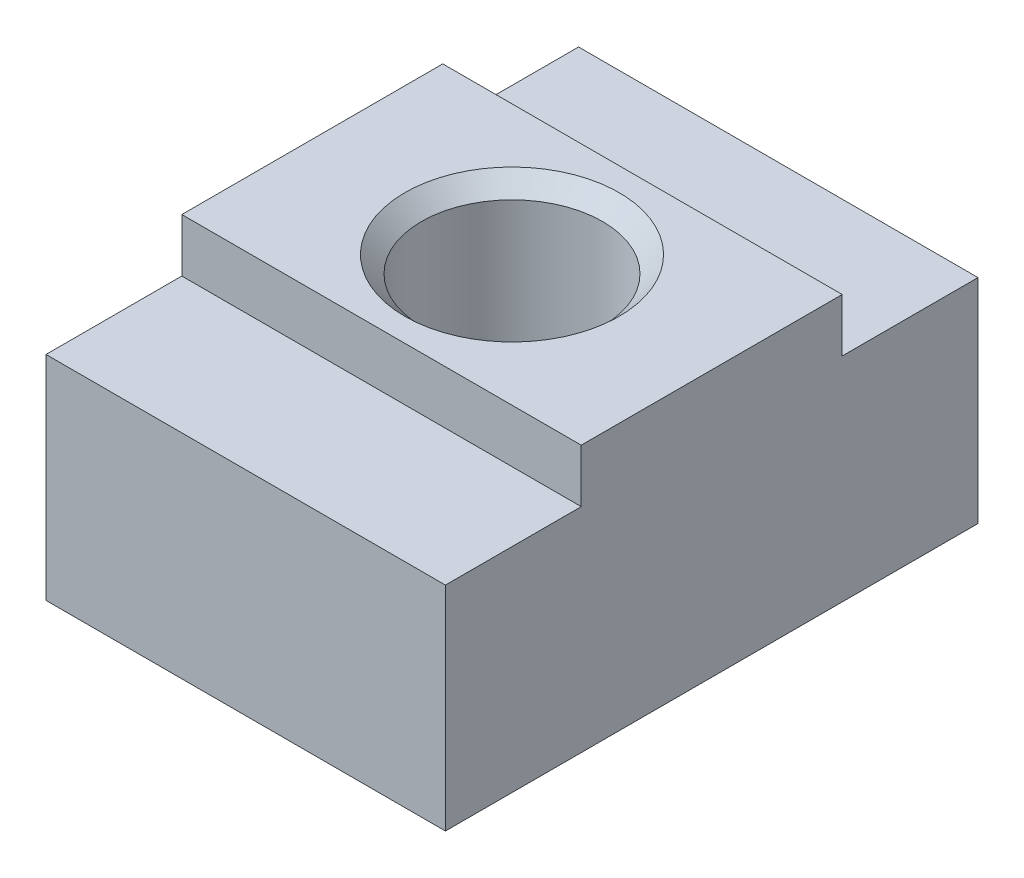
ISO-10303-21;
HEADER;
FILE_DESCRIPTION(('STEP AP214'),'2;1');
FILE_NAME('part.step','',(''),(''),'','','');
FILE_SCHEMA(('AUTOMOTIVE_DESIGN { 1 0 10303 214 1 1 1 1 }'));
ENDSEC;
DATA;
#1=APPLICATION_CONTEXT('core data for automotive mechanical design processes');
#2=APPLICATION_PROTOCOL_DEFINITION('international standard','automotive_design',2000,#1);
#3=PRODUCT_CONTEXT('',#1,'mechanical');
#4=PRODUCT('Part','Part','',(#3));
#5=PRODUCT_RELATED_PRODUCT_CATEGORY('part','',(#4));
#6=PRODUCT_DEFINITION_FORMATION('','',#4);
#7=PRODUCT_DEFINITION_CONTEXT('part definition',#1,'design');
#8=PRODUCT_DEFINITION('design','',#6,#7);
#9=PRODUCT_DEFINITION_SHAPE('','',#8);
#10=(LENGTH_UNIT() NAMED_UNIT(*) SI_UNIT(.MILLI.,.METRE.));
#11=(NAMED_UNIT(*) PLANE_ANGLE_UNIT() SI_UNIT($,.RADIAN.));
#12=(NAMED_UNIT(*) SI_UNIT($,.STERADIAN.) SOLID_ANGLE_UNIT());
#13=UNCERTAINTY_MEASURE_WITH_UNIT(LENGTH_MEASURE(1.E-05),#10,'distance_accuracy_value','');
#14=(GEOMETRIC_REPRESENTATION_CONTEXT(3) GLOBAL_UNCERTAINTY_ASSIGNED_CONTEXT((#13)) GLOBAL_UNIT_ASSIGNED_CONTEXT((#10,
#11,#12)) REPRESENTATION_CONTEXT('',''));
#15=CARTESIAN_POINT('',(0.,0.,0.));
#16=DIRECTION('',(0.,0.,1.));
#17=DIRECTION('',(1.,0.,0.));
#18=AXIS2_PLACEMENT_3D('',#15,#16,#17);
#19=CARTESIAN_POINT('',(7.5,10.,-10.));
#20=DIRECTION('',(0.,1.,0.));
#21=DIRECTION('',(0.,0.,1.));
#22=AXIS2_PLACEMENT_3D('',#19,#20,#21);
#23=CONICAL_SURFACE('',#22,4.025,0.785398163397447);
#24=CARTESIAN_POINT('',(7.5,9.375,-10.));
#25=DIRECTION('',(0.,1.,0.));
#26=DIRECTION('',(0.,0.,1.));
#27=AXIS2_PLACEMENT_3D('',#24,#25,#26);
#28=CIRCLE('',#27,3.4);
#29=CARTESIAN_POINT('',(7.5,9.375,-6.6));
#30=VERTEX_POINT('',#29);
#31=EDGE_CURVE('E11',#30,#30,#28,.T.);
#32=ORIENTED_EDGE('',*,*,#31,.F.);
#33=EDGE_LOOP('',(#32));
#34=FACE_BOUND('',#33,.T.);
#35=CARTESIAN_POINT('',(7.5,10.,-10.));
#36=DIRECTION('',(0.,1.,0.));
#37=DIRECTION('',(0.,0.,1.));
#38=AXIS2_PLACEMENT_3D('',#35,#36,#37);
#39=CIRCLE('',#38,4.025);
#40=CARTESIAN_POINT('',(7.5,10.,-5.975));
#41=VERTEX_POINT('',#40);
#42=EDGE_CURVE('E223',#41,#41,#39,.T.);
#43=ORIENTED_EDGE('',*,*,#42,.T.);
#44=EDGE_LOOP('',(#43));
#45=FACE_BOUND('',#44,.T.);
#46=ADVANCED_FACE('F17',(#34,#45),#23,.F.);
#47=CARTESIAN_POINT('',(7.5,10.,-10.));
#48=DIRECTION('',(0.,1.,0.));
#49=DIRECTION('',(0.,0.,1.));
#50=AXIS2_PLACEMENT_3D('',#47,#48,#49);
#51=CYLINDRICAL_SURFACE('',#50,3.4);
#52=CARTESIAN_POINT('',(7.5,0.625,-10.));
#53=DIRECTION('',(0.,1.,0.));
#54=DIRECTION('',(0.,0.,1.));
#55=AXIS2_PLACEMENT_3D('',#52,#53,#54);
#56=CIRCLE('',#55,3.4);
#57=CARTESIAN_POINT('',(7.5,0.625,-6.6));
#58=VERTEX_POINT('',#57);
#59=EDGE_CURVE('E26',#58,#58,#56,.T.);
#60=ORIENTED_EDGE('',*,*,#59,.F.);
#61=EDGE_LOOP('',(#60));
#62=FACE_BOUND('',#61,.T.);
#63=ORIENTED_EDGE('',*,*,#31,.T.);
#64=EDGE_LOOP('',(#63));
#65=FACE_BOUND('',#64,.T.);
#66=ADVANCED_FACE('F19',(#62,#65),#51,.F.);
#67=CARTESIAN_POINT('',(7.5,0.625,-10.));
#68=DIRECTION('',(0.,-1.,0.));
#69=DIRECTION('',(0.,0.,-1.));
#70=AXIS2_PLACEMENT_3D('',#67,#68,#69);
#71=CONICAL_SURFACE('',#70,3.4,0.785398163397446);
#72=ORIENTED_EDGE('',*,*,#59,.T.);
#73=EDGE_LOOP('',(#72));
#74=FACE_BOUND('',#73,.T.);
#75=CARTESIAN_POINT('',(7.5,0.,-10.));
#76=DIRECTION('',(0.,1.,0.));
#77=DIRECTION('',(0.,0.,1.));
#78=AXIS2_PLACEMENT_3D('',#75,#76,#77);
#79=CIRCLE('',#78,4.025);
#80=CARTESIAN_POINT('',(7.5,0.,-5.975));
#81=VERTEX_POINT('',#80);
#82=EDGE_CURVE('E178',#81,#81,#79,.T.);
#83=ORIENTED_EDGE('',*,*,#82,.F.);
#84=EDGE_LOOP('',(#83));
#85=FACE_BOUND('',#84,.T.);
#86=ADVANCED_FACE('F400',(#74,#85),#71,.F.);
#87=CARTESIAN_POINT('',(0.,10.,0.));
#88=DIRECTION('',(0.,1.,0.));
#89=DIRECTION('',(1.,0.,0.));
#90=AXIS2_PLACEMENT_3D('',#87,#88,#89);
#91=PLANE('',#90);
#92=ORIENTED_EDGE('',*,*,#42,.F.);
#93=EDGE_LOOP('',(#92));
#94=FACE_BOUND('',#93,.T.);
#95=DIRECTION('',(0.,0.,1.));
#96=VECTOR('',#95,1.);
#97=CARTESIAN_POINT('',(0.,10.,-5.1));
#98=LINE('',#97,#96);
#99=CARTESIAN_POINT('',(0.,10.,-14.9));
#100=VERTEX_POINT('',#99);
#101=CARTESIAN_POINT('',(0.,10.,-5.1));
#102=VERTEX_POINT('',#101);
#103=EDGE_CURVE('E156',#100,#102,#98,.T.);
#104=ORIENTED_EDGE('',*,*,#103,.T.);
#105=DIRECTION('',(1.,0.,0.));
#106=VECTOR('',#105,1.);
#107=CARTESIAN_POINT('',(15.,10.,-5.1));
#108=LINE('',#107,#106);
#109=CARTESIAN_POINT('',(15.,10.,-5.1));
#110=VERTEX_POINT('',#109);
#111=EDGE_CURVE('E202',#102,#110,#108,.T.);
#112=ORIENTED_EDGE('',*,*,#111,.T.);
#113=DIRECTION('',(0.,0.,-1.));
#114=VECTOR('',#113,1.);
#115=CARTESIAN_POINT('',(15.,10.,-5.1));
#116=LINE('',#115,#114);
#117=CARTESIAN_POINT('',(15.,10.,-14.9));
#118=VERTEX_POINT('',#117);
#119=EDGE_CURVE('E130',#110,#118,#116,.T.);
#120=ORIENTED_EDGE('',*,*,#119,.T.);
#121=DIRECTION('',(-1.,0.,0.));
#122=VECTOR('',#121,1.);
#123=CARTESIAN_POINT('',(15.,10.,-14.9));
#124=LINE('',#123,#122);
#125=EDGE_CURVE('E125',#118,#100,#124,.T.);
#126=ORIENTED_EDGE('',*,*,#125,.T.);
#127=EDGE_LOOP('',(#104,#112,#120,#126));
#128=FACE_BOUND('',#127,.T.);
#129=ADVANCED_FACE('F386',(#94,#128),#91,.T.);
#130=CARTESIAN_POINT('',(15.,10.,-14.9));
#131=DIRECTION('',(0.,0.,1.));
#132=DIRECTION('',(1.,0.,0.));
#133=AXIS2_PLACEMENT_3D('',#130,#131,#132);
#134=PLANE('',#133);
#135=DIRECTION('',(-1.,0.,0.));
#136=VECTOR('',#135,1.);
#137=CARTESIAN_POINT('',(15.,8.,-14.9));
#138=LINE('',#137,#136);
#139=CARTESIAN_POINT('',(15.,8.,-14.9));
#140=VERTEX_POINT('',#139);
#141=CARTESIAN_POINT('',(0.,8.,-14.9));
#142=VERTEX_POINT('',#141);
#143=EDGE_CURVE('E124',#140,#142,#138,.T.);
#144=ORIENTED_EDGE('',*,*,#143,.T.);
#145=DIRECTION('',(0.,-1.,0.));
#146=VECTOR('',#145,1.);
#147=CARTESIAN_POINT('',(0.,10.,-14.9));
#148=LINE('',#147,#146);
#149=EDGE_CURVE('E160',#100,#142,#148,.T.);
#150=ORIENTED_EDGE('',*,*,#149,.F.);
#151=ORIENTED_EDGE('',*,*,#125,.F.);
#152=DIRECTION('',(0.,-1.,0.));
#153=VECTOR('',#152,1.);
#154=CARTESIAN_POINT('',(15.,10.,-14.9));
#155=LINE('',#154,#153);
#156=EDGE_CURVE('E119',#118,#140,#155,.T.);
#157=ORIENTED_EDGE('',*,*,#156,.T.);
#158=EDGE_LOOP('',(#144,#150,#151,#157));
#159=FACE_BOUND('',#158,.T.);
#160=ADVANCED_FACE('F121',(#159),#134,.F.);
#161=CARTESIAN_POINT('',(15.,10.,-5.1));
#162=DIRECTION('',(0.,0.,-1.));
#163=DIRECTION('',(0.,-1.,0.));
#164=AXIS2_PLACEMENT_3D('',#161,#162,#163);
#165=PLANE('',#164);
#166=DIRECTION('',(1.,0.,0.));
#167=VECTOR('',#166,1.);
#168=CARTESIAN_POINT('',(15.,8.,-5.1));
#169=LINE('',#168,#167);
#170=CARTESIAN_POINT('',(0.,8.,-5.1));
#171=VERTEX_POINT('',#170);
#172=CARTESIAN_POINT('',(15.,8.,-5.1));
#173=VERTEX_POINT('',#172);
#174=EDGE_CURVE('E164',#171,#173,#169,.T.);
#175=ORIENTED_EDGE('',*,*,#174,.T.);
#176=DIRECTION('',(0.,-1.,0.));
#177=VECTOR('',#176,1.);
#178=CARTESIAN_POINT('',(15.,10.,-5.1));
#179=LINE('',#178,#177);
#180=EDGE_CURVE('E179',#110,#173,#179,.T.);
#181=ORIENTED_EDGE('',*,*,#180,.F.);
#182=ORIENTED_EDGE('',*,*,#111,.F.);
#183=DIRECTION('',(0.,-1.,0.));
#184=VECTOR('',#183,1.);
#185=CARTESIAN_POINT('',(0.,10.,-5.1));
#186=LINE('',#185,#184);
#187=EDGE_CURVE('E161',#102,#171,#186,.T.);
#188=ORIENTED_EDGE('',*,*,#187,.T.);
#189=EDGE_LOOP('',(#175,#181,#182,#188));
#190=FACE_BOUND('',#189,.T.);
#191=ADVANCED_FACE('F385',(#190),#165,.F.);
#192=CARTESIAN_POINT('',(0.,0.,0.));
#193=DIRECTION('',(0.,-1.,0.));
#194=DIRECTION('',(0.,0.,-1.));
#195=AXIS2_PLACEMENT_3D('',#192,#193,#194);
#196=PLANE('',#195);
#197=ORIENTED_EDGE('',*,*,#82,.T.);
#198=EDGE_LOOP('',(#197));
#199=FACE_BOUND('',#198,.T.);
#200=DIRECTION('',(0.,0.,1.));
#201=VECTOR('',#200,1.);
#202=CARTESIAN_POINT('',(0.,0.,0.));
#203=LINE('',#202,#201);
#204=CARTESIAN_POINT('',(0.,0.,-20.));
#205=VERTEX_POINT('',#204);
#206=CARTESIAN_POINT('',(0.,0.,0.));
#207=VERTEX_POINT('',#206);
#208=EDGE_CURVE('E196',#205,#207,#203,.T.);
#209=ORIENTED_EDGE('',*,*,#208,.F.);
#210=DIRECTION('',(-1.,0.,0.));
#211=VECTOR('',#210,1.);
#212=CARTESIAN_POINT('',(0.,0.,-20.));
#213=LINE('',#212,#211);
#214=CARTESIAN_POINT('',(15.,0.,-20.));
#215=VERTEX_POINT('',#214);
#216=EDGE_CURVE('E175',#215,#205,#213,.T.);
#217=ORIENTED_EDGE('',*,*,#216,.F.);
#218=DIRECTION('',(0.,0.,-1.));
#219=VECTOR('',#218,1.);
#220=CARTESIAN_POINT('',(15.,0.,0.));
#221=LINE('',#220,#219);
#222=CARTESIAN_POINT('',(15.,0.,0.));
#223=VERTEX_POINT('',#222);
#224=EDGE_CURVE('E210',#223,#215,#221,.T.);
#225=ORIENTED_EDGE('',*,*,#224,.F.);
#226=DIRECTION('',(1.,0.,0.));
#227=VECTOR('',#226,1.);
#228=CARTESIAN_POINT('',(0.,0.,0.));
#229=LINE('',#228,#227);
#230=EDGE_CURVE('E180',#207,#223,#229,.T.);
#231=ORIENTED_EDGE('',*,*,#230,.F.);
#232=EDGE_LOOP('',(#209,#217,#225,#231));
#233=FACE_BOUND('',#232,.T.);
#234=ADVANCED_FACE('F436',(#199,#233),#196,.T.);
#235=CARTESIAN_POINT('',(0.,8.,-20.));
#236=DIRECTION('',(0.,0.,1.));
#237=DIRECTION('',(1.,0.,0.));
#238=AXIS2_PLACEMENT_3D('',#235,#236,#237);
#239=PLANE('',#238);
#240=ORIENTED_EDGE('',*,*,#216,.T.);
#241=DIRECTION('',(0.,-1.,0.));
#242=VECTOR('',#241,1.);
#243=CARTESIAN_POINT('',(0.,8.,-20.));
#244=LINE('',#243,#242);
#245=CARTESIAN_POINT('',(0.,8.,-20.));
#246=VERTEX_POINT('',#245);
#247=EDGE_CURVE('E184',#246,#205,#244,.T.);
#248=ORIENTED_EDGE('',*,*,#247,.F.);
#249=DIRECTION('',(-1.,0.,0.));
#250=VECTOR('',#249,1.);
#251=CARTESIAN_POINT('',(0.,8.,-20.));
#252=LINE('',#251,#250);
#253=CARTESIAN_POINT('',(15.,8.,-20.));
#254=VERTEX_POINT('',#253);
#255=EDGE_CURVE('E142',#254,#246,#252,.T.);
#256=ORIENTED_EDGE('',*,*,#255,.F.);
#257=DIRECTION('',(0.,-1.,0.));
#258=VECTOR('',#257,1.);
#259=CARTESIAN_POINT('',(15.,8.,-20.));
#260=LINE('',#259,#258);
#261=EDGE_CURVE('E131',#254,#215,#260,.T.);
#262=ORIENTED_EDGE('',*,*,#261,.T.);
#263=EDGE_LOOP('',(#240,#248,#256,#262));
#264=FACE_BOUND('',#263,.T.);
#265=ADVANCED_FACE('F428',(#264),#239,.F.);
#266=CARTESIAN_POINT('',(15.,8.,0.));
#267=DIRECTION('',(-1.,0.,0.));
#268=DIRECTION('',(0.,0.,1.));
#269=AXIS2_PLACEMENT_3D('',#266,#267,#268);
#270=PLANE('',#269);
#271=ORIENTED_EDGE('',*,*,#224,.T.);
#272=ORIENTED_EDGE('',*,*,#261,.F.);
#273=DIRECTION('',(0.,0.,-1.));
#274=VECTOR('',#273,1.);
#275=CARTESIAN_POINT('',(15.,8.,0.));
#276=LINE('',#275,#274);
#277=EDGE_CURVE('E134',#140,#254,#276,.T.);
#278=ORIENTED_EDGE('',*,*,#277,.F.);
#279=ORIENTED_EDGE('',*,*,#156,.F.);
#280=ORIENTED_EDGE('',*,*,#119,.F.);
#281=ORIENTED_EDGE('',*,*,#180,.T.);
#282=DIRECTION('',(0.,0.,-1.));
#283=VECTOR('',#282,1.);
#284=CARTESIAN_POINT('',(15.,8.,0.));
#285=LINE('',#284,#283);
#286=CARTESIAN_POINT('',(15.,8.,0.));
#287=VERTEX_POINT('',#286);
#288=EDGE_CURVE('E188',#287,#173,#285,.T.);
#289=ORIENTED_EDGE('',*,*,#288,.F.);
#290=DIRECTION('',(0.,-1.,0.));
#291=VECTOR('',#290,1.);
#292=CARTESIAN_POINT('',(15.,8.,0.));
#293=LINE('',#292,#291);
#294=EDGE_CURVE('E154',#287,#223,#293,.T.);
#295=ORIENTED_EDGE('',*,*,#294,.T.);
#296=EDGE_LOOP('',(#271,#272,#278,#279,#280,#281,#289,#295));
#297=FACE_BOUND('',#296,.T.);
#298=ADVANCED_FACE('F136',(#297),#270,.F.);
#299=CARTESIAN_POINT('',(0.,8.,0.));
#300=DIRECTION('',(0.,0.,-1.));
#301=DIRECTION('',(0.,-1.,0.));
#302=AXIS2_PLACEMENT_3D('',#299,#300,#301);
#303=PLANE('',#302);
#304=ORIENTED_EDGE('',*,*,#230,.T.);
#305=ORIENTED_EDGE('',*,*,#294,.F.);
#306=DIRECTION('',(1.,0.,0.));
#307=VECTOR('',#306,1.);
#308=CARTESIAN_POINT('',(0.,8.,0.));
#309=LINE('',#308,#307);
#310=CARTESIAN_POINT('',(0.,8.,0.));
#311=VERTEX_POINT('',#310);
#312=EDGE_CURVE('E171',#311,#287,#309,.T.);
#313=ORIENTED_EDGE('',*,*,#312,.F.);
#314=DIRECTION('',(0.,-1.,0.));
#315=VECTOR('',#314,1.);
#316=CARTESIAN_POINT('',(0.,8.,0.));
#317=LINE('',#316,#315);
#318=EDGE_CURVE('E192',#311,#207,#317,.T.);
#319=ORIENTED_EDGE('',*,*,#318,.T.);
#320=EDGE_LOOP('',(#304,#305,#313,#319));
#321=FACE_BOUND('',#320,.T.);
#322=ADVANCED_FACE('F411',(#321),#303,.F.);
#323=CARTESIAN_POINT('',(0.,8.,0.));
#324=DIRECTION('',(1.,0.,0.));
#325=DIRECTION('',(0.,1.,0.));
#326=AXIS2_PLACEMENT_3D('',#323,#324,#325);
#327=PLANE('',#326);
#328=ORIENTED_EDGE('',*,*,#208,.T.);
#329=ORIENTED_EDGE('',*,*,#318,.F.);
#330=DIRECTION('',(0.,0.,1.));
#331=VECTOR('',#330,1.);
#332=CARTESIAN_POINT('',(0.,8.,0.));
#333=LINE('',#332,#331);
#334=EDGE_CURVE('E167',#171,#311,#333,.T.);
#335=ORIENTED_EDGE('',*,*,#334,.F.);
#336=ORIENTED_EDGE('',*,*,#187,.F.);
#337=ORIENTED_EDGE('',*,*,#103,.F.);
#338=ORIENTED_EDGE('',*,*,#149,.T.);
#339=DIRECTION('',(0.,0.,1.));
#340=VECTOR('',#339,1.);
#341=CARTESIAN_POINT('',(0.,8.,0.));
#342=LINE('',#341,#340);
#343=EDGE_CURVE('E147',#246,#142,#342,.T.);
#344=ORIENTED_EDGE('',*,*,#343,.F.);
#345=ORIENTED_EDGE('',*,*,#247,.T.);
#346=EDGE_LOOP('',(#328,#329,#335,#336,#337,#338,#344,#345));
#347=FACE_BOUND('',#346,.T.);
#348=ADVANCED_FACE('F394',(#347),#327,.F.);
#349=CARTESIAN_POINT('',(0.,8.,0.));
#350=DIRECTION('',(0.,-1.,0.));
#351=DIRECTION('',(0.,0.,-1.));
#352=AXIS2_PLACEMENT_3D('',#349,#350,#351);
#353=PLANE('',#352);
#354=ORIENTED_EDGE('',*,*,#174,.F.);
#355=ORIENTED_EDGE('',*,*,#334,.T.);
#356=ORIENTED_EDGE('',*,*,#312,.T.);
#357=ORIENTED_EDGE('',*,*,#288,.T.);
#358=EDGE_LOOP('',(#354,#355,#356,#357));
#359=FACE_BOUND('',#358,.T.);
#360=ADVANCED_FACE('F378',(#359),#353,.F.);
#361=CARTESIAN_POINT('',(0.,8.,0.));
#362=DIRECTION('',(0.,-1.,0.));
#363=DIRECTION('',(0.,0.,-1.));
#364=AXIS2_PLACEMENT_3D('',#361,#362,#363);
#365=PLANE('',#364);
#366=ORIENTED_EDGE('',*,*,#143,.F.);
#367=ORIENTED_EDGE('',*,*,#277,.T.);
#368=ORIENTED_EDGE('',*,*,#255,.T.);
#369=ORIENTED_EDGE('',*,*,#343,.T.);
#370=EDGE_LOOP('',(#366,#367,#368,#369));
#371=FACE_BOUND('',#370,.T.);
#372=ADVANCED_FACE('F145',(#371),#365,.F.);
#373=CLOSED_SHELL('',(#46,#66,#86,#129,#160,#191,#234,#265,#298,#322,#348,#360,#372));
#374=MANIFOLD_SOLID_BREP('B1',#373);
#375=ADVANCED_BREP_SHAPE_REPRESENTATION('',(#18,#374),#14);
#376=SHAPE_DEFINITION_REPRESENTATION(#9,#375);
ENDSEC;
END-ISO-10303-21;
